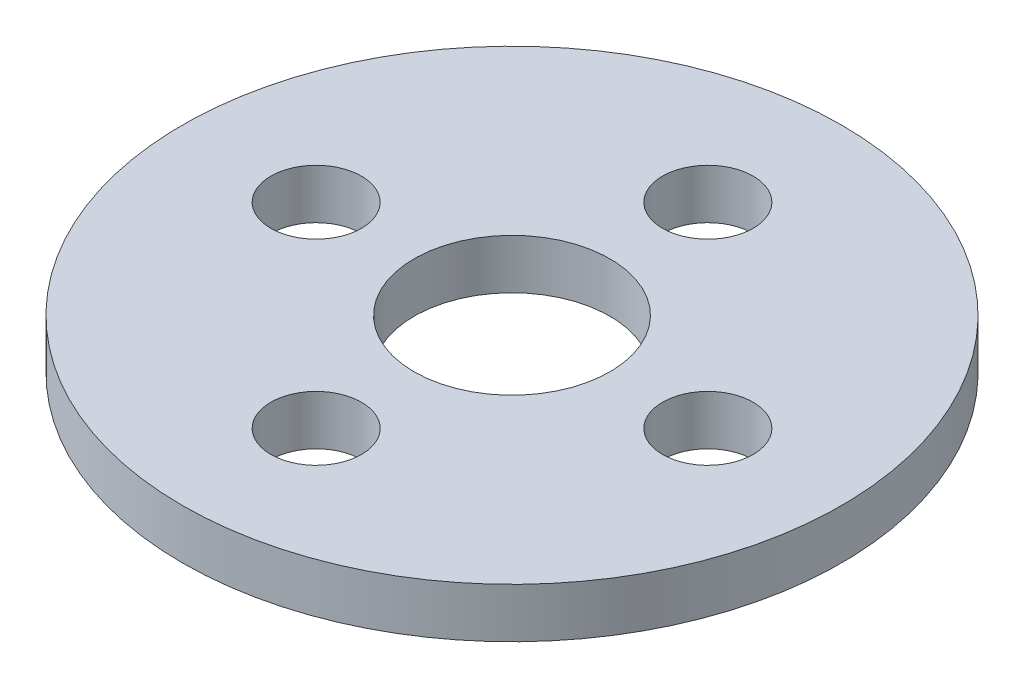
ISO-10303-21;
HEADER;
FILE_DESCRIPTION(('STEP AP214'),'2;1');
FILE_NAME('part.step','',(''),(''),'','','');
FILE_SCHEMA(('AUTOMOTIVE_DESIGN { 1 0 10303 214 1 1 1 1 }'));
ENDSEC;
DATA;
#1=APPLICATION_CONTEXT('core data for automotive mechanical design processes');
#2=APPLICATION_PROTOCOL_DEFINITION('international standard','automotive_design',2000,#1);
#3=PRODUCT_CONTEXT('',#1,'mechanical');
#4=PRODUCT('Part','Part','',(#3));
#5=PRODUCT_RELATED_PRODUCT_CATEGORY('part','',(#4));
#6=PRODUCT_DEFINITION_FORMATION('','',#4);
#7=PRODUCT_DEFINITION_CONTEXT('part definition',#1,'design');
#8=PRODUCT_DEFINITION('design','',#6,#7);
#9=PRODUCT_DEFINITION_SHAPE('','',#8);
#10=(LENGTH_UNIT() NAMED_UNIT(*) SI_UNIT(.MILLI.,.METRE.));
#11=(NAMED_UNIT(*) PLANE_ANGLE_UNIT() SI_UNIT($,.RADIAN.));
#12=(NAMED_UNIT(*) SI_UNIT($,.STERADIAN.) SOLID_ANGLE_UNIT());
#13=UNCERTAINTY_MEASURE_WITH_UNIT(LENGTH_MEASURE(1.E-05),#10,'distance_accuracy_value','');
#14=(GEOMETRIC_REPRESENTATION_CONTEXT(3) GLOBAL_UNCERTAINTY_ASSIGNED_CONTEXT((#13)) GLOBAL_UNIT_ASSIGNED_CONTEXT((#10,
#11,#12)) REPRESENTATION_CONTEXT('',''));
#15=CARTESIAN_POINT('',(0.,0.,0.));
#16=DIRECTION('',(0.,0.,1.));
#17=DIRECTION('',(1.,0.,0.));
#18=AXIS2_PLACEMENT_3D('',#15,#16,#17);
#19=CARTESIAN_POINT('',(0.,2.032,0.));
#20=DIRECTION('',(0.,1.,0.));
#21=DIRECTION('',(0.,0.,1.));
#22=AXIS2_PLACEMENT_3D('',#19,#20,#21);
#23=PLANE('',#22);
#24=CARTESIAN_POINT('',(0.,2.032,8.));
#25=DIRECTION('',(0.,1.,0.));
#26=DIRECTION('',(0.,0.,1.));
#27=AXIS2_PLACEMENT_3D('',#24,#25,#26);
#28=CIRCLE('',#27,1.85);
#29=CARTESIAN_POINT('',(0.,2.032,9.85));
#30=VERTEX_POINT('',#29);
#31=EDGE_CURVE('E58',#30,#30,#28,.T.);
#32=ORIENTED_EDGE('',*,*,#31,.F.);
#33=EDGE_LOOP('',(#32));
#34=FACE_BOUND('',#33,.T.);
#35=CARTESIAN_POINT('',(8.,2.032,0.));
#36=DIRECTION('',(0.,1.,0.));
#37=DIRECTION('',(0.,0.,1.));
#38=AXIS2_PLACEMENT_3D('',#35,#36,#37);
#39=CIRCLE('',#38,1.85);
#40=CARTESIAN_POINT('',(8.,2.032,1.85));
#41=VERTEX_POINT('',#40);
#42=EDGE_CURVE('E46',#41,#41,#39,.T.);
#43=ORIENTED_EDGE('',*,*,#42,.F.);
#44=EDGE_LOOP('',(#43));
#45=FACE_BOUND('',#44,.T.);
#46=CARTESIAN_POINT('',(0.,2.032,0.));
#47=DIRECTION('',(0.,1.,0.));
#48=DIRECTION('',(0.,0.,1.));
#49=AXIS2_PLACEMENT_3D('',#46,#47,#48);
#50=CIRCLE('',#49,13.462);
#51=CARTESIAN_POINT('',(0.,2.032,13.462));
#52=VERTEX_POINT('',#51);
#53=EDGE_CURVE('E10',#52,#52,#50,.T.);
#54=ORIENTED_EDGE('',*,*,#53,.T.);
#55=EDGE_LOOP('',(#54));
#56=FACE_BOUND('',#55,.T.);
#57=CARTESIAN_POINT('',(0.,2.032,0.));
#58=DIRECTION('',(0.,1.,0.));
#59=DIRECTION('',(0.,0.,1.));
#60=AXIS2_PLACEMENT_3D('',#57,#58,#59);
#61=CIRCLE('',#60,4.);
#62=CARTESIAN_POINT('',(0.,2.032,4.));
#63=VERTEX_POINT('',#62);
#64=EDGE_CURVE('E41',#63,#63,#61,.T.);
#65=ORIENTED_EDGE('',*,*,#64,.F.);
#66=EDGE_LOOP('',(#65));
#67=FACE_BOUND('',#66,.T.);
#68=CARTESIAN_POINT('',(-8.,2.032,0.));
#69=DIRECTION('',(0.,1.,0.));
#70=DIRECTION('',(0.,0.,1.));
#71=AXIS2_PLACEMENT_3D('',#68,#69,#70);
#72=CIRCLE('',#71,1.85);
#73=CARTESIAN_POINT('',(-8.,2.032,1.85));
#74=VERTEX_POINT('',#73);
#75=EDGE_CURVE('E52',#74,#74,#72,.T.);
#76=ORIENTED_EDGE('',*,*,#75,.F.);
#77=EDGE_LOOP('',(#76));
#78=FACE_BOUND('',#77,.T.);
#79=CARTESIAN_POINT('',(0.,2.032,-8.));
#80=DIRECTION('',(0.,1.,0.));
#81=DIRECTION('',(0.,0.,1.));
#82=AXIS2_PLACEMENT_3D('',#79,#80,#81);
#83=CIRCLE('',#82,1.85);
#84=CARTESIAN_POINT('',(0.,2.032,-6.15));
#85=VERTEX_POINT('',#84);
#86=EDGE_CURVE('E64',#85,#85,#83,.T.);
#87=ORIENTED_EDGE('',*,*,#86,.F.);
#88=EDGE_LOOP('',(#87));
#89=FACE_BOUND('',#88,.T.);
#90=ADVANCED_FACE('F30',(#34,#45,#56,#67,#78,#89),#23,.T.);
#91=CARTESIAN_POINT('',(0.,0.,0.));
#92=DIRECTION('',(0.,1.,0.));
#93=DIRECTION('',(0.,0.,1.));
#94=AXIS2_PLACEMENT_3D('',#91,#92,#93);
#95=PLANE('',#94);
#96=CARTESIAN_POINT('',(0.,0.,0.));
#97=DIRECTION('',(0.,1.,0.));
#98=DIRECTION('',(0.,0.,1.));
#99=AXIS2_PLACEMENT_3D('',#96,#97,#98);
#100=CIRCLE('',#99,13.462);
#101=CARTESIAN_POINT('',(0.,0.,13.462));
#102=VERTEX_POINT('',#101);
#103=EDGE_CURVE('E34',#102,#102,#100,.T.);
#104=ORIENTED_EDGE('',*,*,#103,.F.);
#105=EDGE_LOOP('',(#104));
#106=FACE_BOUND('',#105,.T.);
#107=CARTESIAN_POINT('',(0.,0.,0.));
#108=DIRECTION('',(0.,1.,0.));
#109=DIRECTION('',(0.,0.,1.));
#110=AXIS2_PLACEMENT_3D('',#107,#108,#109);
#111=CIRCLE('',#110,4.);
#112=CARTESIAN_POINT('',(0.,0.,4.));
#113=VERTEX_POINT('',#112);
#114=EDGE_CURVE('E43',#113,#113,#111,.T.);
#115=ORIENTED_EDGE('',*,*,#114,.T.);
#116=EDGE_LOOP('',(#115));
#117=FACE_BOUND('',#116,.T.);
#118=CARTESIAN_POINT('',(8.,0.,0.));
#119=DIRECTION('',(0.,1.,0.));
#120=DIRECTION('',(0.,0.,1.));
#121=AXIS2_PLACEMENT_3D('',#118,#119,#120);
#122=CIRCLE('',#121,1.85);
#123=CARTESIAN_POINT('',(8.,0.,1.85));
#124=VERTEX_POINT('',#123);
#125=EDGE_CURVE('E49',#124,#124,#122,.T.);
#126=ORIENTED_EDGE('',*,*,#125,.T.);
#127=EDGE_LOOP('',(#126));
#128=FACE_BOUND('',#127,.T.);
#129=CARTESIAN_POINT('',(-8.,0.,0.));
#130=DIRECTION('',(0.,1.,0.));
#131=DIRECTION('',(0.,0.,1.));
#132=AXIS2_PLACEMENT_3D('',#129,#130,#131);
#133=CIRCLE('',#132,1.85);
#134=CARTESIAN_POINT('',(-8.,0.,1.85));
#135=VERTEX_POINT('',#134);
#136=EDGE_CURVE('E55',#135,#135,#133,.T.);
#137=ORIENTED_EDGE('',*,*,#136,.T.);
#138=EDGE_LOOP('',(#137));
#139=FACE_BOUND('',#138,.T.);
#140=CARTESIAN_POINT('',(0.,0.,8.));
#141=DIRECTION('',(0.,1.,0.));
#142=DIRECTION('',(0.,0.,1.));
#143=AXIS2_PLACEMENT_3D('',#140,#141,#142);
#144=CIRCLE('',#143,1.85);
#145=CARTESIAN_POINT('',(0.,0.,9.85));
#146=VERTEX_POINT('',#145);
#147=EDGE_CURVE('E61',#146,#146,#144,.T.);
#148=ORIENTED_EDGE('',*,*,#147,.T.);
#149=EDGE_LOOP('',(#148));
#150=FACE_BOUND('',#149,.T.);
#151=CARTESIAN_POINT('',(0.,0.,-8.));
#152=DIRECTION('',(0.,1.,0.));
#153=DIRECTION('',(0.,0.,1.));
#154=AXIS2_PLACEMENT_3D('',#151,#152,#153);
#155=CIRCLE('',#154,1.85);
#156=CARTESIAN_POINT('',(0.,0.,-6.15));
#157=VERTEX_POINT('',#156);
#158=EDGE_CURVE('E67',#157,#157,#155,.T.);
#159=ORIENTED_EDGE('',*,*,#158,.T.);
#160=EDGE_LOOP('',(#159));
#161=FACE_BOUND('',#160,.T.);
#162=ADVANCED_FACE('F77',(#106,#117,#128,#139,#150,#161),#95,.F.);
#163=CARTESIAN_POINT('',(0.,2.032,0.));
#164=DIRECTION('',(0.,-1.,0.));
#165=DIRECTION('',(0.,0.,-1.));
#166=AXIS2_PLACEMENT_3D('',#163,#164,#165);
#167=CYLINDRICAL_SURFACE('',#166,13.462);
#168=ORIENTED_EDGE('',*,*,#53,.F.);
#169=EDGE_LOOP('',(#168));
#170=FACE_BOUND('',#169,.T.);
#171=ORIENTED_EDGE('',*,*,#103,.T.);
#172=EDGE_LOOP('',(#171));
#173=FACE_BOUND('',#172,.T.);
#174=ADVANCED_FACE('F32',(#170,#173),#167,.T.);
#175=CARTESIAN_POINT('',(0.,2.032,0.));
#176=DIRECTION('',(0.,-1.,0.));
#177=DIRECTION('',(0.,0.,-1.));
#178=AXIS2_PLACEMENT_3D('',#175,#176,#177);
#179=CYLINDRICAL_SURFACE('',#178,4.);
#180=ORIENTED_EDGE('',*,*,#64,.T.);
#181=EDGE_LOOP('',(#180));
#182=FACE_BOUND('',#181,.T.);
#183=ORIENTED_EDGE('',*,*,#114,.F.);
#184=EDGE_LOOP('',(#183));
#185=FACE_BOUND('',#184,.T.);
#186=ADVANCED_FACE('F87',(#182,#185),#179,.F.);
#187=CARTESIAN_POINT('',(8.,2.032,0.));
#188=DIRECTION('',(0.,-1.,0.));
#189=DIRECTION('',(0.,0.,-1.));
#190=AXIS2_PLACEMENT_3D('',#187,#188,#189);
#191=CYLINDRICAL_SURFACE('',#190,1.85);
#192=ORIENTED_EDGE('',*,*,#42,.T.);
#193=EDGE_LOOP('',(#192));
#194=FACE_BOUND('',#193,.T.);
#195=ORIENTED_EDGE('',*,*,#125,.F.);
#196=EDGE_LOOP('',(#195));
#197=FACE_BOUND('',#196,.T.);
#198=ADVANCED_FACE('F90',(#194,#197),#191,.F.);
#199=CARTESIAN_POINT('',(-8.,2.032,0.));
#200=DIRECTION('',(0.,-1.,0.));
#201=DIRECTION('',(0.,0.,-1.));
#202=AXIS2_PLACEMENT_3D('',#199,#200,#201);
#203=CYLINDRICAL_SURFACE('',#202,1.85);
#204=ORIENTED_EDGE('',*,*,#75,.T.);
#205=EDGE_LOOP('',(#204));
#206=FACE_BOUND('',#205,.T.);
#207=ORIENTED_EDGE('',*,*,#136,.F.);
#208=EDGE_LOOP('',(#207));
#209=FACE_BOUND('',#208,.T.);
#210=ADVANCED_FACE('F94',(#206,#209),#203,.F.);
#211=CARTESIAN_POINT('',(0.,2.032,8.));
#212=DIRECTION('',(0.,-1.,0.));
#213=DIRECTION('',(0.,0.,-1.));
#214=AXIS2_PLACEMENT_3D('',#211,#212,#213);
#215=CYLINDRICAL_SURFACE('',#214,1.85);
#216=ORIENTED_EDGE('',*,*,#31,.T.);
#217=EDGE_LOOP('',(#216));
#218=FACE_BOUND('',#217,.T.);
#219=ORIENTED_EDGE('',*,*,#147,.F.);
#220=EDGE_LOOP('',(#219));
#221=FACE_BOUND('',#220,.T.);
#222=ADVANCED_FACE('F98',(#218,#221),#215,.F.);
#223=CARTESIAN_POINT('',(0.,2.032,-8.));
#224=DIRECTION('',(0.,-1.,0.));
#225=DIRECTION('',(0.,0.,-1.));
#226=AXIS2_PLACEMENT_3D('',#223,#224,#225);
#227=CYLINDRICAL_SURFACE('',#226,1.85);
#228=ORIENTED_EDGE('',*,*,#86,.T.);
#229=EDGE_LOOP('',(#228));
#230=FACE_BOUND('',#229,.T.);
#231=ORIENTED_EDGE('',*,*,#158,.F.);
#232=EDGE_LOOP('',(#231));
#233=FACE_BOUND('',#232,.T.);
#234=ADVANCED_FACE('F73',(#230,#233),#227,.F.);
#235=CLOSED_SHELL('',(#90,#162,#174,#186,#198,#210,#222,#234));
#236=MANIFOLD_SOLID_BREP('B2',#235);
#237=ADVANCED_BREP_SHAPE_REPRESENTATION('',(#18,#236),#14);
#238=SHAPE_DEFINITION_REPRESENTATION(#9,#237);
ENDSEC;
END-ISO-10303-21;
